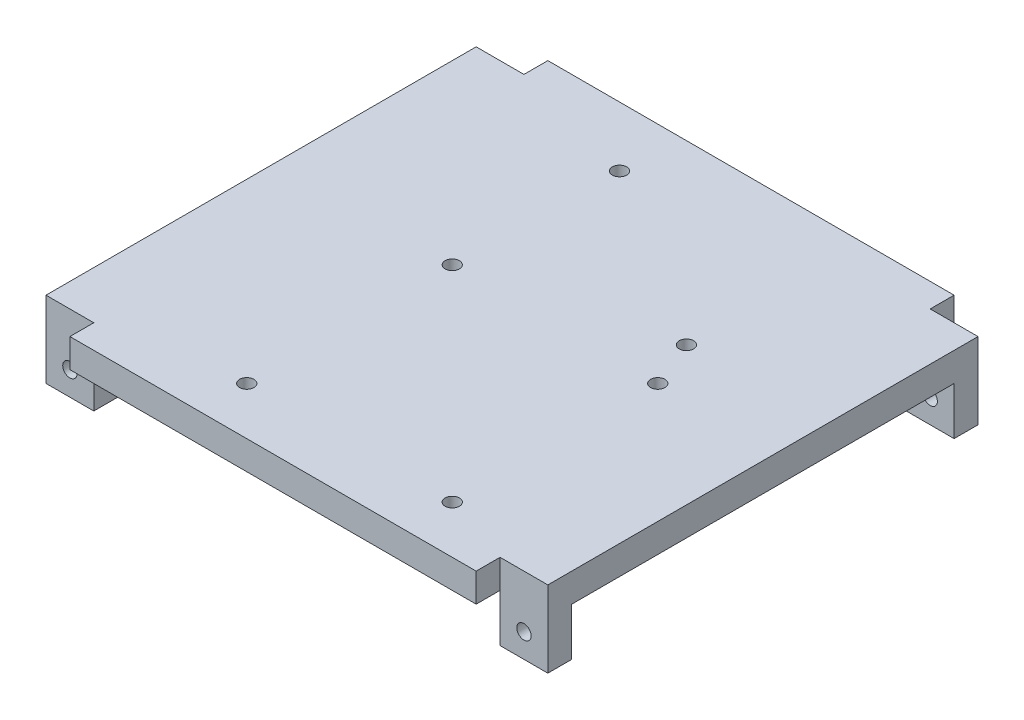
ISO-10303-21;
HEADER;
FILE_DESCRIPTION(('STEP AP214'),'2;1');
FILE_NAME('part.step','',(''),(''),'','','');
FILE_SCHEMA(('AUTOMOTIVE_DESIGN { 1 0 10303 214 1 1 1 1 }'));
ENDSEC;
DATA;
#1=APPLICATION_CONTEXT('core data for automotive mechanical design processes');
#2=APPLICATION_PROTOCOL_DEFINITION('international standard','automotive_design',2000,#1);
#3=PRODUCT_CONTEXT('',#1,'mechanical');
#4=PRODUCT('Part','Part','',(#3));
#5=PRODUCT_RELATED_PRODUCT_CATEGORY('part','',(#4));
#6=PRODUCT_DEFINITION_FORMATION('','',#4);
#7=PRODUCT_DEFINITION_CONTEXT('part definition',#1,'design');
#8=PRODUCT_DEFINITION('design','',#6,#7);
#9=PRODUCT_DEFINITION_SHAPE('','',#8);
#10=(LENGTH_UNIT() NAMED_UNIT(*) SI_UNIT(.MILLI.,.METRE.));
#11=(NAMED_UNIT(*) PLANE_ANGLE_UNIT() SI_UNIT($,.RADIAN.));
#12=(NAMED_UNIT(*) SI_UNIT($,.STERADIAN.) SOLID_ANGLE_UNIT());
#13=UNCERTAINTY_MEASURE_WITH_UNIT(LENGTH_MEASURE(1.E-05),#10,'distance_accuracy_value','');
#14=(GEOMETRIC_REPRESENTATION_CONTEXT(3) GLOBAL_UNCERTAINTY_ASSIGNED_CONTEXT((#13)) GLOBAL_UNIT_ASSIGNED_CONTEXT((#10,
#11,#12)) REPRESENTATION_CONTEXT('',''));
#15=CARTESIAN_POINT('',(0.,0.,0.));
#16=DIRECTION('',(0.,0.,1.));
#17=DIRECTION('',(1.,0.,0.));
#18=AXIS2_PLACEMENT_3D('',#15,#16,#17);
#19=CARTESIAN_POINT('',(0.,0.,0.));
#20=DIRECTION('',(0.,-1.,0.));
#21=DIRECTION('',(0.,0.,-1.));
#22=AXIS2_PLACEMENT_3D('',#19,#20,#21);
#23=PLANE('',#22);
#24=CARTESIAN_POINT('',(76.,0.,-63.));
#25=DIRECTION('',(0.,-1.,0.));
#26=DIRECTION('',(0.,0.,-1.));
#27=AXIS2_PLACEMENT_3D('',#24,#25,#26);
#28=CIRCLE('',#27,1.5);
#29=CARTESIAN_POINT('',(76.,0.,-64.5));
#30=VERTEX_POINT('',#29);
#31=EDGE_CURVE('E418',#30,#30,#28,.T.);
#32=ORIENTED_EDGE('',*,*,#31,.F.);
#33=EDGE_LOOP('',(#32));
#34=FACE_BOUND('',#33,.T.);
#35=CARTESIAN_POINT('',(37.5,0.,-87.5));
#36=DIRECTION('',(0.,-1.,0.));
#37=DIRECTION('',(0.,0.,-1.));
#38=AXIS2_PLACEMENT_3D('',#35,#36,#37);
#39=CIRCLE('',#38,1.5);
#40=CARTESIAN_POINT('',(37.5,0.,-89.));
#41=VERTEX_POINT('',#40);
#42=EDGE_CURVE('E412',#41,#41,#39,.T.);
#43=ORIENTED_EDGE('',*,*,#42,.F.);
#44=EDGE_LOOP('',(#43));
#45=FACE_BOUND('',#44,.T.);
#46=CARTESIAN_POINT('',(80.,0.,-10.));
#47=DIRECTION('',(0.,-1.,0.));
#48=DIRECTION('',(0.,0.,-1.));
#49=AXIS2_PLACEMENT_3D('',#46,#47,#48);
#50=CIRCLE('',#49,1.5);
#51=CARTESIAN_POINT('',(80.,0.,-11.5));
#52=VERTEX_POINT('',#51);
#53=EDGE_CURVE('E406',#52,#52,#50,.T.);
#54=ORIENTED_EDGE('',*,*,#53,.F.);
#55=EDGE_LOOP('',(#54));
#56=FACE_BOUND('',#55,.T.);
#57=CARTESIAN_POINT('',(80.,0.,-53.));
#58=DIRECTION('',(0.,-1.,0.));
#59=DIRECTION('',(0.,0.,-1.));
#60=AXIS2_PLACEMENT_3D('',#57,#58,#59);
#61=CIRCLE('',#60,1.5);
#62=CARTESIAN_POINT('',(80.,0.,-54.5));
#63=VERTEX_POINT('',#62);
#64=EDGE_CURVE('E400',#63,#63,#61,.T.);
#65=ORIENTED_EDGE('',*,*,#64,.F.);
#66=EDGE_LOOP('',(#65));
#67=FACE_BOUND('',#66,.T.);
#68=CARTESIAN_POINT('',(37.,0.,-53.));
#69=DIRECTION('',(0.,-1.,0.));
#70=DIRECTION('',(0.,0.,-1.));
#71=AXIS2_PLACEMENT_3D('',#68,#69,#70);
#72=CIRCLE('',#71,1.5);
#73=CARTESIAN_POINT('',(37.,0.,-54.5));
#74=VERTEX_POINT('',#73);
#75=EDGE_CURVE('E394',#74,#74,#72,.T.);
#76=ORIENTED_EDGE('',*,*,#75,.F.);
#77=EDGE_LOOP('',(#76));
#78=FACE_BOUND('',#77,.T.);
#79=CARTESIAN_POINT('',(37.,0.,-10.));
#80=DIRECTION('',(0.,-1.,0.));
#81=DIRECTION('',(0.,0.,-1.));
#82=AXIS2_PLACEMENT_3D('',#79,#80,#81);
#83=CIRCLE('',#82,1.5);
#84=CARTESIAN_POINT('',(37.,0.,-11.5));
#85=VERTEX_POINT('',#84);
#86=EDGE_CURVE('E388',#85,#85,#83,.T.);
#87=ORIENTED_EDGE('',*,*,#86,.F.);
#88=EDGE_LOOP('',(#87));
#89=FACE_BOUND('',#88,.T.);
#90=DIRECTION('',(-1.,0.,0.));
#91=VECTOR('',#90,1.);
#92=CARTESIAN_POINT('',(0.,0.,-90.));
#93=LINE('',#92,#91);
#94=CARTESIAN_POINT('',(9.99999999999999,0.,-90.));
#95=VERTEX_POINT('',#94);
#96=CARTESIAN_POINT('',(0.,0.,-90.));
#97=VERTEX_POINT('',#96);
#98=EDGE_CURVE('E214',#95,#97,#93,.T.);
#99=ORIENTED_EDGE('',*,*,#98,.F.);
#100=DIRECTION('',(0.,0.,1.));
#101=VECTOR('',#100,1.);
#102=CARTESIAN_POINT('',(9.99999999999998,0.,-95.));
#103=LINE('',#102,#101);
#104=CARTESIAN_POINT('',(9.99999999999998,0.,-95.));
#105=VERTEX_POINT('',#104);
#106=EDGE_CURVE('E216',#105,#95,#103,.T.);
#107=ORIENTED_EDGE('',*,*,#106,.F.);
#108=DIRECTION('',(0.,0.,1.));
#109=VECTOR('',#108,1.);
#110=CARTESIAN_POINT('',(10.,0.,-100.));
#111=LINE('',#110,#109);
#112=CARTESIAN_POINT('',(10.,0.,-100.));
#113=VERTEX_POINT('',#112);
#114=EDGE_CURVE('E326',#113,#105,#111,.T.);
#115=ORIENTED_EDGE('',*,*,#114,.F.);
#116=DIRECTION('',(-1.,0.,0.));
#117=VECTOR('',#116,1.);
#118=CARTESIAN_POINT('',(0.,0.,-100.));
#119=LINE('',#118,#117);
#120=CARTESIAN_POINT('',(95.,0.,-100.));
#121=VERTEX_POINT('',#120);
#122=EDGE_CURVE('E354',#121,#113,#119,.T.);
#123=ORIENTED_EDGE('',*,*,#122,.F.);
#124=DIRECTION('',(0.,0.,-1.));
#125=VECTOR('',#124,1.);
#126=CARTESIAN_POINT('',(95.,0.,-100.));
#127=LINE('',#126,#125);
#128=CARTESIAN_POINT('',(95.,0.,-95.));
#129=VERTEX_POINT('',#128);
#130=EDGE_CURVE('E336',#129,#121,#127,.T.);
#131=ORIENTED_EDGE('',*,*,#130,.F.);
#132=DIRECTION('',(0.,0.,-1.));
#133=VECTOR('',#132,1.);
#134=CARTESIAN_POINT('',(95.,0.,-95.));
#135=LINE('',#134,#133);
#136=CARTESIAN_POINT('',(95.,0.,-90.));
#137=VERTEX_POINT('',#136);
#138=EDGE_CURVE('E279',#137,#129,#135,.T.);
#139=ORIENTED_EDGE('',*,*,#138,.F.);
#140=DIRECTION('',(-1.,0.,0.));
#141=VECTOR('',#140,1.);
#142=CARTESIAN_POINT('',(105.,0.,-90.));
#143=LINE('',#142,#141);
#144=CARTESIAN_POINT('',(105.,0.,-90.));
#145=VERTEX_POINT('',#144);
#146=EDGE_CURVE('E274',#145,#137,#143,.T.);
#147=ORIENTED_EDGE('',*,*,#146,.F.);
#148=DIRECTION('',(0.,0.,-1.));
#149=VECTOR('',#148,1.);
#150=CARTESIAN_POINT('',(105.,0.,0.));
#151=LINE('',#150,#149);
#152=CARTESIAN_POINT('',(105.,0.,-10.));
#153=VERTEX_POINT('',#152);
#154=EDGE_CURVE('E50',#153,#145,#151,.T.);
#155=ORIENTED_EDGE('',*,*,#154,.F.);
#156=DIRECTION('',(1.,0.,0.));
#157=VECTOR('',#156,1.);
#158=CARTESIAN_POINT('',(105.,0.,-10.));
#159=LINE('',#158,#157);
#160=CARTESIAN_POINT('',(95.,0.,-10.));
#161=VERTEX_POINT('',#160);
#162=EDGE_CURVE('E259',#161,#153,#159,.T.);
#163=ORIENTED_EDGE('',*,*,#162,.F.);
#164=DIRECTION('',(0.,0.,-1.));
#165=VECTOR('',#164,1.);
#166=CARTESIAN_POINT('',(95.,0.,-5.00000000000001));
#167=LINE('',#166,#165);
#168=CARTESIAN_POINT('',(95.,0.,-5.00000000000001));
#169=VERTEX_POINT('',#168);
#170=EDGE_CURVE('E254',#169,#161,#167,.T.);
#171=ORIENTED_EDGE('',*,*,#170,.F.);
#172=DIRECTION('',(0.,0.,-1.));
#173=VECTOR('',#172,1.);
#174=CARTESIAN_POINT('',(95.,0.,0.));
#175=LINE('',#174,#173);
#176=CARTESIAN_POINT('',(95.,0.,0.));
#177=VERTEX_POINT('',#176);
#178=EDGE_CURVE('E310',#177,#169,#175,.T.);
#179=ORIENTED_EDGE('',*,*,#178,.F.);
#180=DIRECTION('',(1.,0.,0.));
#181=VECTOR('',#180,1.);
#182=CARTESIAN_POINT('',(0.,0.,0.));
#183=LINE('',#182,#181);
#184=CARTESIAN_POINT('',(10.,0.,0.));
#185=VERTEX_POINT('',#184);
#186=EDGE_CURVE('E58',#185,#177,#183,.T.);
#187=ORIENTED_EDGE('',*,*,#186,.F.);
#188=DIRECTION('',(0.,0.,1.));
#189=VECTOR('',#188,1.);
#190=CARTESIAN_POINT('',(10.,0.,0.));
#191=LINE('',#190,#189);
#192=CARTESIAN_POINT('',(9.99999999999999,0.,-5.00000000000001));
#193=VERTEX_POINT('',#192);
#194=EDGE_CURVE('E295',#193,#185,#191,.T.);
#195=ORIENTED_EDGE('',*,*,#194,.F.);
#196=DIRECTION('',(0.,0.,1.));
#197=VECTOR('',#196,1.);
#198=CARTESIAN_POINT('',(9.99999999999998,0.,-5.));
#199=LINE('',#198,#197);
#200=CARTESIAN_POINT('',(9.99999999999998,0.,-10.));
#201=VERTEX_POINT('',#200);
#202=EDGE_CURVE('E236',#201,#193,#199,.T.);
#203=ORIENTED_EDGE('',*,*,#202,.F.);
#204=DIRECTION('',(1.,0.,0.));
#205=VECTOR('',#204,1.);
#206=CARTESIAN_POINT('',(0.,0.,-10.));
#207=LINE('',#206,#205);
#208=CARTESIAN_POINT('',(0.,0.,-10.));
#209=VERTEX_POINT('',#208);
#210=EDGE_CURVE('E231',#209,#201,#207,.T.);
#211=ORIENTED_EDGE('',*,*,#210,.F.);
#212=DIRECTION('',(0.,0.,1.));
#213=VECTOR('',#212,1.);
#214=CARTESIAN_POINT('',(0.,0.,0.));
#215=LINE('',#214,#213);
#216=EDGE_CURVE('E351',#97,#209,#215,.T.);
#217=ORIENTED_EDGE('',*,*,#216,.F.);
#218=EDGE_LOOP('',(#99,#107,#115,#123,#131,#139,#147,#155,#163,#171,#179,#187,#195,#203,#211,#217));
#219=FACE_BOUND('',#218,.T.);
#220=ADVANCED_FACE('F33',(#34,#45,#56,#67,#78,#89,#219),#23,.T.);
#221=CARTESIAN_POINT('',(0.,6.,0.));
#222=DIRECTION('',(1.,0.,0.));
#223=DIRECTION('',(0.,0.,-1.));
#224=AXIS2_PLACEMENT_3D('',#221,#222,#223);
#225=PLANE('',#224);
#226=DIRECTION('',(0.,-1.,0.));
#227=VECTOR('',#226,1.);
#228=CARTESIAN_POINT('',(0.,10.,-95.));
#229=LINE('',#228,#227);
#230=CARTESIAN_POINT('',(0.,6.,-95.));
#231=VERTEX_POINT('',#230);
#232=CARTESIAN_POINT('',(0.,-10.,-95.));
#233=VERTEX_POINT('',#232);
#234=EDGE_CURVE('E188',#231,#233,#229,.T.);
#235=ORIENTED_EDGE('',*,*,#234,.T.);
#236=DIRECTION('',(0.,0.,-1.));
#237=VECTOR('',#236,1.);
#238=CARTESIAN_POINT('',(0.,-10.,-95.));
#239=LINE('',#238,#237);
#240=CARTESIAN_POINT('',(0.,-10.,-90.));
#241=VERTEX_POINT('',#240);
#242=EDGE_CURVE('E192',#241,#233,#239,.T.);
#243=ORIENTED_EDGE('',*,*,#242,.F.);
#244=DIRECTION('',(0.,1.,0.));
#245=VECTOR('',#244,1.);
#246=CARTESIAN_POINT('',(0.,-10.,-90.));
#247=LINE('',#246,#245);
#248=EDGE_CURVE('E224',#241,#97,#247,.T.);
#249=ORIENTED_EDGE('',*,*,#248,.T.);
#250=ORIENTED_EDGE('',*,*,#216,.T.);
#251=DIRECTION('',(0.,1.,0.));
#252=VECTOR('',#251,1.);
#253=CARTESIAN_POINT('',(0.,-10.,-10.));
#254=LINE('',#253,#252);
#255=CARTESIAN_POINT('',(0.,-10.,-10.));
#256=VERTEX_POINT('',#255);
#257=EDGE_CURVE('E251',#256,#209,#254,.T.);
#258=ORIENTED_EDGE('',*,*,#257,.F.);
#259=DIRECTION('',(0.,0.,-1.));
#260=VECTOR('',#259,1.);
#261=CARTESIAN_POINT('',(0.,-10.,-5.00000000000001));
#262=LINE('',#261,#260);
#263=CARTESIAN_POINT('',(0.,-10.,-5.00000000000001));
#264=VERTEX_POINT('',#263);
#265=EDGE_CURVE('E232',#264,#256,#262,.T.);
#266=ORIENTED_EDGE('',*,*,#265,.F.);
#267=DIRECTION('',(0.,-1.,0.));
#268=VECTOR('',#267,1.);
#269=CARTESIAN_POINT('',(0.,10.,-5.00000000000001));
#270=LINE('',#269,#268);
#271=CARTESIAN_POINT('',(0.,6.,-5.00000000000001));
#272=VERTEX_POINT('',#271);
#273=EDGE_CURVE('E297',#272,#264,#270,.T.);
#274=ORIENTED_EDGE('',*,*,#273,.F.);
#275=DIRECTION('',(0.,0.,1.));
#276=VECTOR('',#275,1.);
#277=CARTESIAN_POINT('',(0.,6.,0.));
#278=LINE('',#277,#276);
#279=EDGE_CURVE('E195',#231,#272,#278,.T.);
#280=ORIENTED_EDGE('',*,*,#279,.F.);
#281=EDGE_LOOP('',(#235,#243,#249,#250,#258,#266,#274,#280));
#282=FACE_BOUND('',#281,.T.);
#283=ADVANCED_FACE('F35',(#282),#225,.F.);
#284=CARTESIAN_POINT('',(0.,6.,0.));
#285=DIRECTION('',(0.,0.,-1.));
#286=DIRECTION('',(-1.,0.,0.));
#287=AXIS2_PLACEMENT_3D('',#284,#285,#286);
#288=PLANE('',#287);
#289=DIRECTION('',(1.,0.,0.));
#290=VECTOR('',#289,1.);
#291=CARTESIAN_POINT('',(0.,6.,0.));
#292=LINE('',#291,#290);
#293=CARTESIAN_POINT('',(10.,6.,0.));
#294=VERTEX_POINT('',#293);
#295=CARTESIAN_POINT('',(95.,6.,0.));
#296=VERTEX_POINT('',#295);
#297=EDGE_CURVE('E353',#294,#296,#292,.T.);
#298=ORIENTED_EDGE('',*,*,#297,.F.);
#299=DIRECTION('',(0.,-1.,0.));
#300=VECTOR('',#299,1.);
#301=CARTESIAN_POINT('',(10.,10.,0.));
#302=LINE('',#301,#300);
#303=EDGE_CURVE('E298',#294,#185,#302,.T.);
#304=ORIENTED_EDGE('',*,*,#303,.T.);
#305=ORIENTED_EDGE('',*,*,#186,.T.);
#306=DIRECTION('',(0.,-1.,0.));
#307=VECTOR('',#306,1.);
#308=CARTESIAN_POINT('',(95.,10.,0.));
#309=LINE('',#308,#307);
#310=EDGE_CURVE('E313',#296,#177,#309,.T.);
#311=ORIENTED_EDGE('',*,*,#310,.F.);
#312=EDGE_LOOP('',(#298,#304,#305,#311));
#313=FACE_BOUND('',#312,.T.);
#314=ADVANCED_FACE('F545',(#313),#288,.F.);
#315=CARTESIAN_POINT('',(105.,6.,0.));
#316=DIRECTION('',(-1.,0.,0.));
#317=DIRECTION('',(0.,0.,1.));
#318=AXIS2_PLACEMENT_3D('',#315,#316,#317);
#319=PLANE('',#318);
#320=DIRECTION('',(0.,0.,-1.));
#321=VECTOR('',#320,1.);
#322=CARTESIAN_POINT('',(105.,6.,0.));
#323=LINE('',#322,#321);
#324=CARTESIAN_POINT('',(105.,6.,-5.00000000000001));
#325=VERTEX_POINT('',#324);
#326=CARTESIAN_POINT('',(105.,6.,-95.));
#327=VERTEX_POINT('',#326);
#328=EDGE_CURVE('E42',#325,#327,#323,.T.);
#329=ORIENTED_EDGE('',*,*,#328,.F.);
#330=DIRECTION('',(0.,-1.,0.));
#331=VECTOR('',#330,1.);
#332=CARTESIAN_POINT('',(105.,10.,-5.00000000000001));
#333=LINE('',#332,#331);
#334=CARTESIAN_POINT('',(105.,-10.,-5.00000000000001));
#335=VERTEX_POINT('',#334);
#336=EDGE_CURVE('E314',#325,#335,#333,.T.);
#337=ORIENTED_EDGE('',*,*,#336,.T.);
#338=DIRECTION('',(0.,0.,1.));
#339=VECTOR('',#338,1.);
#340=CARTESIAN_POINT('',(105.,-10.,-5.00000000000001));
#341=LINE('',#340,#339);
#342=CARTESIAN_POINT('',(105.,-10.,-10.));
#343=VERTEX_POINT('',#342);
#344=EDGE_CURVE('E255',#343,#335,#341,.T.);
#345=ORIENTED_EDGE('',*,*,#344,.F.);
#346=DIRECTION('',(0.,1.,0.));
#347=VECTOR('',#346,1.);
#348=CARTESIAN_POINT('',(105.,-10.,-10.));
#349=LINE('',#348,#347);
#350=EDGE_CURVE('E265',#343,#153,#349,.T.);
#351=ORIENTED_EDGE('',*,*,#350,.T.);
#352=ORIENTED_EDGE('',*,*,#154,.T.);
#353=DIRECTION('',(0.,1.,0.));
#354=VECTOR('',#353,1.);
#355=CARTESIAN_POINT('',(105.,-10.,-90.));
#356=LINE('',#355,#354);
#357=CARTESIAN_POINT('',(105.,-10.,-90.));
#358=VERTEX_POINT('',#357);
#359=EDGE_CURVE('E294',#358,#145,#356,.T.);
#360=ORIENTED_EDGE('',*,*,#359,.F.);
#361=DIRECTION('',(0.,0.,1.));
#362=VECTOR('',#361,1.);
#363=CARTESIAN_POINT('',(105.,-10.,-95.));
#364=LINE('',#363,#362);
#365=CARTESIAN_POINT('',(105.,-10.,-95.));
#366=VERTEX_POINT('',#365);
#367=EDGE_CURVE('E275',#366,#358,#364,.T.);
#368=ORIENTED_EDGE('',*,*,#367,.F.);
#369=DIRECTION('',(0.,-1.,0.));
#370=VECTOR('',#369,1.);
#371=CARTESIAN_POINT('',(105.,10.,-95.));
#372=LINE('',#371,#370);
#373=EDGE_CURVE('E338',#327,#366,#372,.T.);
#374=ORIENTED_EDGE('',*,*,#373,.F.);
#375=EDGE_LOOP('',(#329,#337,#345,#351,#352,#360,#368,#374));
#376=FACE_BOUND('',#375,.T.);
#377=ADVANCED_FACE('F494',(#376),#319,.F.);
#378=CARTESIAN_POINT('',(0.,6.,-100.));
#379=DIRECTION('',(0.,0.,1.));
#380=DIRECTION('',(1.,0.,0.));
#381=AXIS2_PLACEMENT_3D('',#378,#379,#380);
#382=PLANE('',#381);
#383=ORIENTED_EDGE('',*,*,#122,.T.);
#384=DIRECTION('',(0.,-1.,0.));
#385=VECTOR('',#384,1.);
#386=CARTESIAN_POINT('',(10.,10.,-100.));
#387=LINE('',#386,#385);
#388=CARTESIAN_POINT('',(10.,6.,-100.));
#389=VERTEX_POINT('',#388);
#390=EDGE_CURVE('E328',#389,#113,#387,.T.);
#391=ORIENTED_EDGE('',*,*,#390,.F.);
#392=DIRECTION('',(-1.,0.,0.));
#393=VECTOR('',#392,1.);
#394=CARTESIAN_POINT('',(0.,6.,-100.));
#395=LINE('',#394,#393);
#396=CARTESIAN_POINT('',(95.,6.,-100.));
#397=VERTEX_POINT('',#396);
#398=EDGE_CURVE('E11',#397,#389,#395,.T.);
#399=ORIENTED_EDGE('',*,*,#398,.F.);
#400=DIRECTION('',(0.,-1.,0.));
#401=VECTOR('',#400,1.);
#402=CARTESIAN_POINT('',(95.,10.,-100.));
#403=LINE('',#402,#401);
#404=EDGE_CURVE('E339',#397,#121,#403,.T.);
#405=ORIENTED_EDGE('',*,*,#404,.T.);
#406=EDGE_LOOP('',(#383,#391,#399,#405));
#407=FACE_BOUND('',#406,.T.);
#408=ADVANCED_FACE('F482',(#407),#382,.F.);
#409=CARTESIAN_POINT('',(0.,6.,0.));
#410=DIRECTION('',(0.,-1.,0.));
#411=DIRECTION('',(0.,0.,-1.));
#412=AXIS2_PLACEMENT_3D('',#409,#410,#411);
#413=PLANE('',#412);
#414=CARTESIAN_POINT('',(76.,6.,-63.));
#415=DIRECTION('',(0.,-1.,0.));
#416=DIRECTION('',(0.,0.,-1.));
#417=AXIS2_PLACEMENT_3D('',#414,#415,#416);
#418=CIRCLE('',#417,1.5);
#419=CARTESIAN_POINT('',(76.,6.,-64.5));
#420=VERTEX_POINT('',#419);
#421=EDGE_CURVE('E415',#420,#420,#418,.T.);
#422=ORIENTED_EDGE('',*,*,#421,.T.);
#423=EDGE_LOOP('',(#422));
#424=FACE_BOUND('',#423,.T.);
#425=CARTESIAN_POINT('',(37.5,6.,-87.5));
#426=DIRECTION('',(0.,-1.,0.));
#427=DIRECTION('',(0.,0.,-1.));
#428=AXIS2_PLACEMENT_3D('',#425,#426,#427);
#429=CIRCLE('',#428,1.5);
#430=CARTESIAN_POINT('',(37.5,6.,-89.));
#431=VERTEX_POINT('',#430);
#432=EDGE_CURVE('E409',#431,#431,#429,.T.);
#433=ORIENTED_EDGE('',*,*,#432,.T.);
#434=EDGE_LOOP('',(#433));
#435=FACE_BOUND('',#434,.T.);
#436=CARTESIAN_POINT('',(80.,6.,-10.));
#437=DIRECTION('',(0.,-1.,0.));
#438=DIRECTION('',(0.,0.,-1.));
#439=AXIS2_PLACEMENT_3D('',#436,#437,#438);
#440=CIRCLE('',#439,1.5);
#441=CARTESIAN_POINT('',(80.,6.,-11.5));
#442=VERTEX_POINT('',#441);
#443=EDGE_CURVE('E403',#442,#442,#440,.T.);
#444=ORIENTED_EDGE('',*,*,#443,.T.);
#445=EDGE_LOOP('',(#444));
#446=FACE_BOUND('',#445,.T.);
#447=CARTESIAN_POINT('',(80.,6.,-53.));
#448=DIRECTION('',(0.,-1.,0.));
#449=DIRECTION('',(0.,0.,-1.));
#450=AXIS2_PLACEMENT_3D('',#447,#448,#449);
#451=CIRCLE('',#450,1.5);
#452=CARTESIAN_POINT('',(80.,6.,-54.5));
#453=VERTEX_POINT('',#452);
#454=EDGE_CURVE('E397',#453,#453,#451,.T.);
#455=ORIENTED_EDGE('',*,*,#454,.T.);
#456=EDGE_LOOP('',(#455));
#457=FACE_BOUND('',#456,.T.);
#458=CARTESIAN_POINT('',(37.,6.,-53.));
#459=DIRECTION('',(0.,-1.,0.));
#460=DIRECTION('',(0.,0.,-1.));
#461=AXIS2_PLACEMENT_3D('',#458,#459,#460);
#462=CIRCLE('',#461,1.5);
#463=CARTESIAN_POINT('',(37.,6.,-54.5));
#464=VERTEX_POINT('',#463);
#465=EDGE_CURVE('E391',#464,#464,#462,.T.);
#466=ORIENTED_EDGE('',*,*,#465,.T.);
#467=EDGE_LOOP('',(#466));
#468=FACE_BOUND('',#467,.T.);
#469=CARTESIAN_POINT('',(37.,6.,-10.));
#470=DIRECTION('',(0.,-1.,0.));
#471=DIRECTION('',(0.,0.,-1.));
#472=AXIS2_PLACEMENT_3D('',#469,#470,#471);
#473=CIRCLE('',#472,1.5);
#474=CARTESIAN_POINT('',(37.,6.,-11.5));
#475=VERTEX_POINT('',#474);
#476=EDGE_CURVE('E387',#475,#475,#473,.T.);
#477=ORIENTED_EDGE('',*,*,#476,.T.);
#478=EDGE_LOOP('',(#477));
#479=FACE_BOUND('',#478,.T.);
#480=DIRECTION('',(1.,0.,0.));
#481=VECTOR('',#480,1.);
#482=CARTESIAN_POINT('',(0.,6.,-5.00000000000001));
#483=LINE('',#482,#481);
#484=CARTESIAN_POINT('',(9.99999999999999,6.,-5.00000000000001));
#485=VERTEX_POINT('',#484);
#486=EDGE_CURVE('E300',#272,#485,#483,.T.);
#487=ORIENTED_EDGE('',*,*,#486,.T.);
#488=DIRECTION('',(0.,0.,1.));
#489=VECTOR('',#488,1.);
#490=CARTESIAN_POINT('',(10.,6.,0.));
#491=LINE('',#490,#489);
#492=EDGE_CURVE('E307',#485,#294,#491,.T.);
#493=ORIENTED_EDGE('',*,*,#492,.T.);
#494=ORIENTED_EDGE('',*,*,#297,.T.);
#495=DIRECTION('',(0.,0.,-1.));
#496=VECTOR('',#495,1.);
#497=CARTESIAN_POINT('',(95.,6.,0.));
#498=LINE('',#497,#496);
#499=CARTESIAN_POINT('',(95.,6.,-5.00000000000001));
#500=VERTEX_POINT('',#499);
#501=EDGE_CURVE('E316',#296,#500,#498,.T.);
#502=ORIENTED_EDGE('',*,*,#501,.T.);
#503=DIRECTION('',(1.,0.,0.));
#504=VECTOR('',#503,1.);
#505=CARTESIAN_POINT('',(0.,6.,-5.00000000000002));
#506=LINE('',#505,#504);
#507=EDGE_CURVE('E323',#500,#325,#506,.T.);
#508=ORIENTED_EDGE('',*,*,#507,.T.);
#509=ORIENTED_EDGE('',*,*,#328,.T.);
#510=DIRECTION('',(-1.,0.,0.));
#511=VECTOR('',#510,1.);
#512=CARTESIAN_POINT('',(0.,6.,-95.));
#513=LINE('',#512,#511);
#514=CARTESIAN_POINT('',(95.,6.,-95.));
#515=VERTEX_POINT('',#514);
#516=EDGE_CURVE('E342',#327,#515,#513,.T.);
#517=ORIENTED_EDGE('',*,*,#516,.T.);
#518=DIRECTION('',(0.,0.,-1.));
#519=VECTOR('',#518,1.);
#520=CARTESIAN_POINT('',(95.,6.,0.));
#521=LINE('',#520,#519);
#522=EDGE_CURVE('E348',#515,#397,#521,.T.);
#523=ORIENTED_EDGE('',*,*,#522,.T.);
#524=ORIENTED_EDGE('',*,*,#398,.T.);
#525=DIRECTION('',(0.,0.,1.));
#526=VECTOR('',#525,1.);
#527=CARTESIAN_POINT('',(10.,6.,0.));
#528=LINE('',#527,#526);
#529=CARTESIAN_POINT('',(10.,6.,-95.));
#530=VERTEX_POINT('',#529);
#531=EDGE_CURVE('E198',#389,#530,#528,.T.);
#532=ORIENTED_EDGE('',*,*,#531,.T.);
#533=DIRECTION('',(-1.,0.,0.));
#534=VECTOR('',#533,1.);
#535=CARTESIAN_POINT('',(0.,6.,-95.));
#536=LINE('',#535,#534);
#537=EDGE_CURVE('E334',#530,#231,#536,.T.);
#538=ORIENTED_EDGE('',*,*,#537,.T.);
#539=ORIENTED_EDGE('',*,*,#279,.T.);
#540=EDGE_LOOP('',(#487,#493,#494,#502,#508,#509,#517,#523,#524,#532,#538,#539));
#541=FACE_BOUND('',#540,.T.);
#542=ADVANCED_FACE('F424',(#424,#435,#446,#457,#468,#479,#541),#413,.F.);
#543=CARTESIAN_POINT('',(95.,10.,-100.));
#544=DIRECTION('',(-1.,0.,0.));
#545=DIRECTION('',(0.,0.,1.));
#546=AXIS2_PLACEMENT_3D('',#543,#544,#545);
#547=PLANE('',#546);
#548=DIRECTION('',(0.,-1.,0.));
#549=VECTOR('',#548,1.);
#550=CARTESIAN_POINT('',(95.,10.,-95.));
#551=LINE('',#550,#549);
#552=EDGE_CURVE('E343',#515,#129,#551,.T.);
#553=ORIENTED_EDGE('',*,*,#552,.T.);
#554=ORIENTED_EDGE('',*,*,#130,.T.);
#555=ORIENTED_EDGE('',*,*,#404,.F.);
#556=ORIENTED_EDGE('',*,*,#522,.F.);
#557=EDGE_LOOP('',(#553,#554,#555,#556));
#558=FACE_BOUND('',#557,.T.);
#559=ADVANCED_FACE('F485',(#558),#547,.F.);
#560=CARTESIAN_POINT('',(105.,10.,-95.));
#561=DIRECTION('',(0.,0.,1.));
#562=DIRECTION('',(1.,0.,0.));
#563=AXIS2_PLACEMENT_3D('',#560,#561,#562);
#564=PLANE('',#563);
#565=CARTESIAN_POINT('',(100.,-5.,-95.));
#566=DIRECTION('',(0.,0.,-1.));
#567=DIRECTION('',(-1.,0.,0.));
#568=AXIS2_PLACEMENT_3D('',#565,#566,#567);
#569=CIRCLE('',#568,1.5);
#570=CARTESIAN_POINT('',(98.5,-5.,-95.));
#571=VERTEX_POINT('',#570);
#572=EDGE_CURVE('E369',#571,#571,#569,.T.);
#573=ORIENTED_EDGE('',*,*,#572,.F.);
#574=EDGE_LOOP('',(#573));
#575=FACE_BOUND('',#574,.T.);
#576=ORIENTED_EDGE('',*,*,#373,.T.);
#577=DIRECTION('',(1.,0.,0.));
#578=VECTOR('',#577,1.);
#579=CARTESIAN_POINT('',(105.,-10.,-95.));
#580=LINE('',#579,#578);
#581=CARTESIAN_POINT('',(95.,-10.,-95.));
#582=VERTEX_POINT('',#581);
#583=EDGE_CURVE('E283',#582,#366,#580,.T.);
#584=ORIENTED_EDGE('',*,*,#583,.F.);
#585=DIRECTION('',(0.,1.,0.));
#586=VECTOR('',#585,1.);
#587=CARTESIAN_POINT('',(95.,-10.,-95.));
#588=LINE('',#587,#586);
#589=EDGE_CURVE('E286',#582,#129,#588,.T.);
#590=ORIENTED_EDGE('',*,*,#589,.T.);
#591=ORIENTED_EDGE('',*,*,#552,.F.);
#592=ORIENTED_EDGE('',*,*,#516,.F.);
#593=EDGE_LOOP('',(#576,#584,#590,#591,#592));
#594=FACE_BOUND('',#593,.T.);
#595=ADVANCED_FACE('F491',(#575,#594),#564,.F.);
#596=CARTESIAN_POINT('',(0.,10.,-95.));
#597=DIRECTION('',(0.,0.,1.));
#598=DIRECTION('',(1.,0.,0.));
#599=AXIS2_PLACEMENT_3D('',#596,#597,#598);
#600=PLANE('',#599);
#601=CARTESIAN_POINT('',(4.99999999999998,-5.,-95.));
#602=DIRECTION('',(0.,0.,-1.));
#603=DIRECTION('',(-1.,0.,0.));
#604=AXIS2_PLACEMENT_3D('',#601,#602,#603);
#605=CIRCLE('',#604,1.5);
#606=CARTESIAN_POINT('',(3.49999999999998,-5.,-95.));
#607=VERTEX_POINT('',#606);
#608=EDGE_CURVE('E384',#607,#607,#605,.T.);
#609=ORIENTED_EDGE('',*,*,#608,.F.);
#610=EDGE_LOOP('',(#609));
#611=FACE_BOUND('',#610,.T.);
#612=DIRECTION('',(0.,-1.,0.));
#613=VECTOR('',#612,1.);
#614=CARTESIAN_POINT('',(10.,10.,-95.));
#615=LINE('',#614,#613);
#616=EDGE_CURVE('E199',#530,#105,#615,.T.);
#617=ORIENTED_EDGE('',*,*,#616,.T.);
#618=DIRECTION('',(0.,1.,0.));
#619=VECTOR('',#618,1.);
#620=CARTESIAN_POINT('',(9.99999999999998,-10.,-95.));
#621=LINE('',#620,#619);
#622=CARTESIAN_POINT('',(9.99999999999998,-10.,-95.));
#623=VERTEX_POINT('',#622);
#624=EDGE_CURVE('E205',#623,#105,#621,.T.);
#625=ORIENTED_EDGE('',*,*,#624,.F.);
#626=DIRECTION('',(1.,0.,0.));
#627=VECTOR('',#626,1.);
#628=CARTESIAN_POINT('',(0.,-10.,-95.));
#629=LINE('',#628,#627);
#630=EDGE_CURVE('E202',#233,#623,#629,.T.);
#631=ORIENTED_EDGE('',*,*,#630,.F.);
#632=ORIENTED_EDGE('',*,*,#234,.F.);
#633=ORIENTED_EDGE('',*,*,#537,.F.);
#634=EDGE_LOOP('',(#617,#625,#631,#632,#633));
#635=FACE_BOUND('',#634,.T.);
#636=ADVANCED_FACE('F204',(#611,#635),#600,.F.);
#637=CARTESIAN_POINT('',(10.,10.,-100.));
#638=DIRECTION('',(1.,0.,0.));
#639=DIRECTION('',(0.,0.,-1.));
#640=AXIS2_PLACEMENT_3D('',#637,#638,#639);
#641=PLANE('',#640);
#642=ORIENTED_EDGE('',*,*,#390,.T.);
#643=ORIENTED_EDGE('',*,*,#114,.T.);
#644=ORIENTED_EDGE('',*,*,#616,.F.);
#645=ORIENTED_EDGE('',*,*,#531,.F.);
#646=EDGE_LOOP('',(#642,#643,#644,#645));
#647=FACE_BOUND('',#646,.T.);
#648=ADVANCED_FACE('F476',(#647),#641,.F.);
#649=CARTESIAN_POINT('',(105.,10.,-5.00000000000001));
#650=DIRECTION('',(0.,0.,-1.));
#651=DIRECTION('',(-1.,0.,0.));
#652=AXIS2_PLACEMENT_3D('',#649,#650,#651);
#653=PLANE('',#652);
#654=CARTESIAN_POINT('',(100.,-5.,-5.00000000000001));
#655=DIRECTION('',(0.,0.,-1.));
#656=DIRECTION('',(-1.,0.,0.));
#657=AXIS2_PLACEMENT_3D('',#654,#655,#656);
#658=CIRCLE('',#657,1.5);
#659=CARTESIAN_POINT('',(98.5,-5.,-5.00000000000001));
#660=VERTEX_POINT('',#659);
#661=EDGE_CURVE('E219',#660,#660,#658,.T.);
#662=ORIENTED_EDGE('',*,*,#661,.T.);
#663=EDGE_LOOP('',(#662));
#664=FACE_BOUND('',#663,.T.);
#665=DIRECTION('',(0.,-1.,0.));
#666=VECTOR('',#665,1.);
#667=CARTESIAN_POINT('',(95.,10.,-5.00000000000001));
#668=LINE('',#667,#666);
#669=EDGE_CURVE('E317',#500,#169,#668,.T.);
#670=ORIENTED_EDGE('',*,*,#669,.T.);
#671=DIRECTION('',(0.,1.,0.));
#672=VECTOR('',#671,1.);
#673=CARTESIAN_POINT('',(95.,-10.,-5.00000000000001));
#674=LINE('',#673,#672);
#675=CARTESIAN_POINT('',(95.,-10.,-5.00000000000001));
#676=VERTEX_POINT('',#675);
#677=EDGE_CURVE('E272',#676,#169,#674,.T.);
#678=ORIENTED_EDGE('',*,*,#677,.F.);
#679=DIRECTION('',(-1.,0.,0.));
#680=VECTOR('',#679,1.);
#681=CARTESIAN_POINT('',(105.,-10.,-5.00000000000001));
#682=LINE('',#681,#680);
#683=EDGE_CURVE('E258',#335,#676,#682,.T.);
#684=ORIENTED_EDGE('',*,*,#683,.F.);
#685=ORIENTED_EDGE('',*,*,#336,.F.);
#686=ORIENTED_EDGE('',*,*,#507,.F.);
#687=EDGE_LOOP('',(#670,#678,#684,#685,#686));
#688=FACE_BOUND('',#687,.T.);
#689=ADVANCED_FACE('F523',(#664,#688),#653,.F.);
#690=CARTESIAN_POINT('',(95.,10.,0.));
#691=DIRECTION('',(-1.,0.,0.));
#692=DIRECTION('',(0.,0.,1.));
#693=AXIS2_PLACEMENT_3D('',#690,#691,#692);
#694=PLANE('',#693);
#695=ORIENTED_EDGE('',*,*,#310,.T.);
#696=ORIENTED_EDGE('',*,*,#178,.T.);
#697=ORIENTED_EDGE('',*,*,#669,.F.);
#698=ORIENTED_EDGE('',*,*,#501,.F.);
#699=EDGE_LOOP('',(#695,#696,#697,#698));
#700=FACE_BOUND('',#699,.T.);
#701=ADVANCED_FACE('F521',(#700),#694,.F.);
#702=CARTESIAN_POINT('',(10.,10.,0.));
#703=DIRECTION('',(1.,0.,0.));
#704=DIRECTION('',(0.,0.,-1.));
#705=AXIS2_PLACEMENT_3D('',#702,#703,#704);
#706=PLANE('',#705);
#707=DIRECTION('',(0.,-1.,0.));
#708=VECTOR('',#707,1.);
#709=CARTESIAN_POINT('',(9.99999999999999,10.,-5.00000000000001));
#710=LINE('',#709,#708);
#711=EDGE_CURVE('E301',#485,#193,#710,.T.);
#712=ORIENTED_EDGE('',*,*,#711,.T.);
#713=ORIENTED_EDGE('',*,*,#194,.T.);
#714=ORIENTED_EDGE('',*,*,#303,.F.);
#715=ORIENTED_EDGE('',*,*,#492,.F.);
#716=EDGE_LOOP('',(#712,#713,#714,#715));
#717=FACE_BOUND('',#716,.T.);
#718=ADVANCED_FACE('F469',(#717),#706,.F.);
#719=CARTESIAN_POINT('',(0.,10.,-5.00000000000001));
#720=DIRECTION('',(0.,0.,-1.));
#721=DIRECTION('',(-1.,0.,0.));
#722=AXIS2_PLACEMENT_3D('',#719,#720,#721);
#723=PLANE('',#722);
#724=CARTESIAN_POINT('',(4.99999999999998,-5.,-5.00000000000001));
#725=DIRECTION('',(0.,0.,-1.));
#726=DIRECTION('',(-1.,0.,0.));
#727=AXIS2_PLACEMENT_3D('',#724,#725,#726);
#728=CIRCLE('',#727,1.5);
#729=CARTESIAN_POINT('',(3.49999999999998,-5.,-5.00000000000001));
#730=VERTEX_POINT('',#729);
#731=EDGE_CURVE('E374',#730,#730,#728,.T.);
#732=ORIENTED_EDGE('',*,*,#731,.T.);
#733=EDGE_LOOP('',(#732));
#734=FACE_BOUND('',#733,.T.);
#735=ORIENTED_EDGE('',*,*,#273,.T.);
#736=DIRECTION('',(-1.,0.,0.));
#737=VECTOR('',#736,1.);
#738=CARTESIAN_POINT('',(0.,-10.,-5.00000000000001));
#739=LINE('',#738,#737);
#740=CARTESIAN_POINT('',(9.99999999999998,-10.,-5.));
#741=VERTEX_POINT('',#740);
#742=EDGE_CURVE('E240',#741,#264,#739,.T.);
#743=ORIENTED_EDGE('',*,*,#742,.F.);
#744=DIRECTION('',(0.,1.,0.));
#745=VECTOR('',#744,1.);
#746=CARTESIAN_POINT('',(9.99999999999998,-10.,-5.));
#747=LINE('',#746,#745);
#748=EDGE_CURVE('E243',#741,#193,#747,.T.);
#749=ORIENTED_EDGE('',*,*,#748,.T.);
#750=ORIENTED_EDGE('',*,*,#711,.F.);
#751=ORIENTED_EDGE('',*,*,#486,.F.);
#752=EDGE_LOOP('',(#735,#743,#749,#750,#751));
#753=FACE_BOUND('',#752,.T.);
#754=ADVANCED_FACE('F471',(#734,#753),#723,.F.);
#755=CARTESIAN_POINT('',(105.,-10.,-90.));
#756=DIRECTION('',(0.,0.,-1.));
#757=DIRECTION('',(-1.,0.,0.));
#758=AXIS2_PLACEMENT_3D('',#755,#756,#757);
#759=PLANE('',#758);
#760=CARTESIAN_POINT('',(100.,-5.,-90.));
#761=DIRECTION('',(0.,0.,-1.));
#762=DIRECTION('',(-1.,0.,0.));
#763=AXIS2_PLACEMENT_3D('',#760,#761,#762);
#764=CIRCLE('',#763,1.5);
#765=CARTESIAN_POINT('',(98.5,-5.,-90.));
#766=VERTEX_POINT('',#765);
#767=EDGE_CURVE('E368',#766,#766,#764,.T.);
#768=ORIENTED_EDGE('',*,*,#767,.T.);
#769=EDGE_LOOP('',(#768));
#770=FACE_BOUND('',#769,.T.);
#771=ORIENTED_EDGE('',*,*,#146,.T.);
#772=DIRECTION('',(0.,1.,0.));
#773=VECTOR('',#772,1.);
#774=CARTESIAN_POINT('',(95.,-10.,-90.));
#775=LINE('',#774,#773);
#776=CARTESIAN_POINT('',(95.,-10.,-90.));
#777=VERTEX_POINT('',#776);
#778=EDGE_CURVE('E291',#777,#137,#775,.T.);
#779=ORIENTED_EDGE('',*,*,#778,.F.);
#780=DIRECTION('',(-1.,0.,0.));
#781=VECTOR('',#780,1.);
#782=CARTESIAN_POINT('',(105.,-10.,-90.));
#783=LINE('',#782,#781);
#784=EDGE_CURVE('E278',#358,#777,#783,.T.);
#785=ORIENTED_EDGE('',*,*,#784,.F.);
#786=ORIENTED_EDGE('',*,*,#359,.T.);
#787=EDGE_LOOP('',(#771,#779,#785,#786));
#788=FACE_BOUND('',#787,.T.);
#789=ADVANCED_FACE('F505',(#770,#788),#759,.F.);
#790=CARTESIAN_POINT('',(95.,-10.,-95.));
#791=DIRECTION('',(1.,0.,0.));
#792=DIRECTION('',(0.,0.,-1.));
#793=AXIS2_PLACEMENT_3D('',#790,#791,#792);
#794=PLANE('',#793);
#795=ORIENTED_EDGE('',*,*,#138,.T.);
#796=ORIENTED_EDGE('',*,*,#589,.F.);
#797=DIRECTION('',(0.,0.,-1.));
#798=VECTOR('',#797,1.);
#799=CARTESIAN_POINT('',(95.,-10.,-95.));
#800=LINE('',#799,#798);
#801=EDGE_CURVE('E281',#777,#582,#800,.T.);
#802=ORIENTED_EDGE('',*,*,#801,.F.);
#803=ORIENTED_EDGE('',*,*,#778,.T.);
#804=EDGE_LOOP('',(#795,#796,#802,#803));
#805=FACE_BOUND('',#804,.T.);
#806=ADVANCED_FACE('F502',(#805),#794,.F.);
#807=CARTESIAN_POINT('',(0.,-10.,0.));
#808=DIRECTION('',(0.,-1.,0.));
#809=DIRECTION('',(0.,0.,-1.));
#810=AXIS2_PLACEMENT_3D('',#807,#808,#809);
#811=PLANE('',#810);
#812=ORIENTED_EDGE('',*,*,#367,.T.);
#813=ORIENTED_EDGE('',*,*,#784,.T.);
#814=ORIENTED_EDGE('',*,*,#801,.T.);
#815=ORIENTED_EDGE('',*,*,#583,.T.);
#816=EDGE_LOOP('',(#812,#813,#814,#815));
#817=FACE_BOUND('',#816,.T.);
#818=ADVANCED_FACE('F497',(#817),#811,.T.);
#819=CARTESIAN_POINT('',(95.,-10.,-5.00000000000001));
#820=DIRECTION('',(1.,0.,0.));
#821=DIRECTION('',(0.,0.,-1.));
#822=AXIS2_PLACEMENT_3D('',#819,#820,#821);
#823=PLANE('',#822);
#824=ORIENTED_EDGE('',*,*,#170,.T.);
#825=DIRECTION('',(0.,1.,0.));
#826=VECTOR('',#825,1.);
#827=CARTESIAN_POINT('',(95.,-10.,-10.));
#828=LINE('',#827,#826);
#829=CARTESIAN_POINT('',(95.,-10.,-10.));
#830=VERTEX_POINT('',#829);
#831=EDGE_CURVE('E269',#830,#161,#828,.T.);
#832=ORIENTED_EDGE('',*,*,#831,.F.);
#833=DIRECTION('',(0.,0.,-1.));
#834=VECTOR('',#833,1.);
#835=CARTESIAN_POINT('',(95.,-10.,-5.00000000000001));
#836=LINE('',#835,#834);
#837=EDGE_CURVE('E261',#676,#830,#836,.T.);
#838=ORIENTED_EDGE('',*,*,#837,.F.);
#839=ORIENTED_EDGE('',*,*,#677,.T.);
#840=EDGE_LOOP('',(#824,#832,#838,#839));
#841=FACE_BOUND('',#840,.T.);
#842=ADVANCED_FACE('F568',(#841),#823,.F.);
#843=CARTESIAN_POINT('',(105.,-10.,-10.));
#844=DIRECTION('',(0.,0.,1.));
#845=DIRECTION('',(1.,0.,0.));
#846=AXIS2_PLACEMENT_3D('',#843,#844,#845);
#847=PLANE('',#846);
#848=CARTESIAN_POINT('',(100.,-5.,-10.));
#849=DIRECTION('',(0.,0.,1.));
#850=DIRECTION('',(1.,0.,0.));
#851=AXIS2_PLACEMENT_3D('',#848,#849,#850);
#852=CIRCLE('',#851,1.5);
#853=CARTESIAN_POINT('',(101.5,-5.,-10.));
#854=VERTEX_POINT('',#853);
#855=EDGE_CURVE('E366',#854,#854,#852,.T.);
#856=ORIENTED_EDGE('',*,*,#855,.T.);
#857=EDGE_LOOP('',(#856));
#858=FACE_BOUND('',#857,.T.);
#859=ORIENTED_EDGE('',*,*,#162,.T.);
#860=ORIENTED_EDGE('',*,*,#350,.F.);
#861=DIRECTION('',(1.,0.,0.));
#862=VECTOR('',#861,1.);
#863=CARTESIAN_POINT('',(105.,-10.,-10.));
#864=LINE('',#863,#862);
#865=EDGE_CURVE('E263',#830,#343,#864,.T.);
#866=ORIENTED_EDGE('',*,*,#865,.F.);
#867=ORIENTED_EDGE('',*,*,#831,.T.);
#868=EDGE_LOOP('',(#859,#860,#866,#867));
#869=FACE_BOUND('',#868,.T.);
#870=ADVANCED_FACE('F564',(#858,#869),#847,.F.);
#871=CARTESIAN_POINT('',(0.,-10.,0.));
#872=DIRECTION('',(0.,1.,0.));
#873=DIRECTION('',(0.,0.,1.));
#874=AXIS2_PLACEMENT_3D('',#871,#872,#873);
#875=PLANE('',#874);
#876=ORIENTED_EDGE('',*,*,#344,.T.);
#877=ORIENTED_EDGE('',*,*,#683,.T.);
#878=ORIENTED_EDGE('',*,*,#837,.T.);
#879=ORIENTED_EDGE('',*,*,#865,.T.);
#880=EDGE_LOOP('',(#876,#877,#878,#879));
#881=FACE_BOUND('',#880,.T.);
#882=ADVANCED_FACE('F560',(#881),#875,.F.);
#883=CARTESIAN_POINT('',(0.,-10.,-10.));
#884=DIRECTION('',(0.,0.,1.));
#885=DIRECTION('',(1.,0.,0.));
#886=AXIS2_PLACEMENT_3D('',#883,#884,#885);
#887=PLANE('',#886);
#888=CARTESIAN_POINT('',(4.99999999999998,-5.,-10.));
#889=DIRECTION('',(0.,0.,1.));
#890=DIRECTION('',(1.,0.,0.));
#891=AXIS2_PLACEMENT_3D('',#888,#889,#890);
#892=CIRCLE('',#891,1.5);
#893=CARTESIAN_POINT('',(6.49999999999998,-5.,-10.));
#894=VERTEX_POINT('',#893);
#895=EDGE_CURVE('E379',#894,#894,#892,.T.);
#896=ORIENTED_EDGE('',*,*,#895,.T.);
#897=EDGE_LOOP('',(#896));
#898=FACE_BOUND('',#897,.T.);
#899=ORIENTED_EDGE('',*,*,#210,.T.);
#900=DIRECTION('',(0.,1.,0.));
#901=VECTOR('',#900,1.);
#902=CARTESIAN_POINT('',(9.99999999999998,-10.,-10.));
#903=LINE('',#902,#901);
#904=CARTESIAN_POINT('',(9.99999999999998,-10.,-10.));
#905=VERTEX_POINT('',#904);
#906=EDGE_CURVE('E248',#905,#201,#903,.T.);
#907=ORIENTED_EDGE('',*,*,#906,.F.);
#908=DIRECTION('',(1.,0.,0.));
#909=VECTOR('',#908,1.);
#910=CARTESIAN_POINT('',(0.,-10.,-10.));
#911=LINE('',#910,#909);
#912=EDGE_CURVE('E235',#256,#905,#911,.T.);
#913=ORIENTED_EDGE('',*,*,#912,.F.);
#914=ORIENTED_EDGE('',*,*,#257,.T.);
#915=EDGE_LOOP('',(#899,#907,#913,#914));
#916=FACE_BOUND('',#915,.T.);
#917=ADVANCED_FACE('F458',(#898,#916),#887,.F.);
#918=CARTESIAN_POINT('',(9.99999999999998,-10.,-5.));
#919=DIRECTION('',(-1.,0.,0.));
#920=DIRECTION('',(0.,0.,1.));
#921=AXIS2_PLACEMENT_3D('',#918,#919,#920);
#922=PLANE('',#921);
#923=ORIENTED_EDGE('',*,*,#202,.T.);
#924=ORIENTED_EDGE('',*,*,#748,.F.);
#925=DIRECTION('',(0.,0.,1.));
#926=VECTOR('',#925,1.);
#927=CARTESIAN_POINT('',(9.99999999999998,-10.,-5.));
#928=LINE('',#927,#926);
#929=EDGE_CURVE('E238',#905,#741,#928,.T.);
#930=ORIENTED_EDGE('',*,*,#929,.F.);
#931=ORIENTED_EDGE('',*,*,#906,.T.);
#932=EDGE_LOOP('',(#923,#924,#930,#931));
#933=FACE_BOUND('',#932,.T.);
#934=ADVANCED_FACE('F464',(#933),#922,.F.);
#935=CARTESIAN_POINT('',(0.,-10.,0.));
#936=DIRECTION('',(0.,-1.,0.));
#937=DIRECTION('',(0.,0.,-1.));
#938=AXIS2_PLACEMENT_3D('',#935,#936,#937);
#939=PLANE('',#938);
#940=ORIENTED_EDGE('',*,*,#265,.T.);
#941=ORIENTED_EDGE('',*,*,#912,.T.);
#942=ORIENTED_EDGE('',*,*,#929,.T.);
#943=ORIENTED_EDGE('',*,*,#742,.T.);
#944=EDGE_LOOP('',(#940,#941,#942,#943));
#945=FACE_BOUND('',#944,.T.);
#946=ADVANCED_FACE('F584',(#945),#939,.T.);
#947=CARTESIAN_POINT('',(9.99999999999998,-10.,-95.));
#948=DIRECTION('',(-1.,0.,0.));
#949=DIRECTION('',(0.,0.,1.));
#950=AXIS2_PLACEMENT_3D('',#947,#948,#949);
#951=PLANE('',#950);
#952=ORIENTED_EDGE('',*,*,#106,.T.);
#953=DIRECTION('',(0.,1.,0.));
#954=VECTOR('',#953,1.);
#955=CARTESIAN_POINT('',(9.99999999999999,-10.,-90.));
#956=LINE('',#955,#954);
#957=CARTESIAN_POINT('',(9.99999999999999,-10.,-90.));
#958=VERTEX_POINT('',#957);
#959=EDGE_CURVE('E227',#958,#95,#956,.T.);
#960=ORIENTED_EDGE('',*,*,#959,.F.);
#961=DIRECTION('',(0.,0.,1.));
#962=VECTOR('',#961,1.);
#963=CARTESIAN_POINT('',(9.99999999999998,-10.,-95.));
#964=LINE('',#963,#962);
#965=EDGE_CURVE('E208',#623,#958,#964,.T.);
#966=ORIENTED_EDGE('',*,*,#965,.F.);
#967=ORIENTED_EDGE('',*,*,#624,.T.);
#968=EDGE_LOOP('',(#952,#960,#966,#967));
#969=FACE_BOUND('',#968,.T.);
#970=ADVANCED_FACE('F587',(#969),#951,.F.);
#971=CARTESIAN_POINT('',(0.,-10.,-90.));
#972=DIRECTION('',(0.,0.,-1.));
#973=DIRECTION('',(-1.,0.,0.));
#974=AXIS2_PLACEMENT_3D('',#971,#972,#973);
#975=PLANE('',#974);
#976=CARTESIAN_POINT('',(4.99999999999998,-5.,-90.));
#977=DIRECTION('',(0.,0.,-1.));
#978=DIRECTION('',(-1.,0.,0.));
#979=AXIS2_PLACEMENT_3D('',#976,#977,#978);
#980=CIRCLE('',#979,1.5);
#981=CARTESIAN_POINT('',(3.49999999999998,-5.,-90.));
#982=VERTEX_POINT('',#981);
#983=EDGE_CURVE('E37',#982,#982,#980,.T.);
#984=ORIENTED_EDGE('',*,*,#983,.T.);
#985=EDGE_LOOP('',(#984));
#986=FACE_BOUND('',#985,.T.);
#987=ORIENTED_EDGE('',*,*,#98,.T.);
#988=ORIENTED_EDGE('',*,*,#248,.F.);
#989=DIRECTION('',(-1.,0.,0.));
#990=VECTOR('',#989,1.);
#991=CARTESIAN_POINT('',(0.,-10.,-90.));
#992=LINE('',#991,#990);
#993=EDGE_CURVE('E212',#958,#241,#992,.T.);
#994=ORIENTED_EDGE('',*,*,#993,.F.);
#995=ORIENTED_EDGE('',*,*,#959,.T.);
#996=EDGE_LOOP('',(#987,#988,#994,#995));
#997=FACE_BOUND('',#996,.T.);
#998=ADVANCED_FACE('F453',(#986,#997),#975,.F.);
#999=CARTESIAN_POINT('',(0.,-10.,0.));
#1000=DIRECTION('',(0.,1.,0.));
#1001=DIRECTION('',(0.,0.,1.));
#1002=AXIS2_PLACEMENT_3D('',#999,#1000,#1001);
#1003=PLANE('',#1002);
#1004=ORIENTED_EDGE('',*,*,#242,.T.);
#1005=ORIENTED_EDGE('',*,*,#630,.T.);
#1006=ORIENTED_EDGE('',*,*,#965,.T.);
#1007=ORIENTED_EDGE('',*,*,#993,.T.);
#1008=EDGE_LOOP('',(#1004,#1005,#1006,#1007));
#1009=FACE_BOUND('',#1008,.T.);
#1010=ADVANCED_FACE('F210',(#1009),#1003,.F.);
#1011=CARTESIAN_POINT('',(100.,-5.,0.));
#1012=DIRECTION('',(0.,0.,-1.));
#1013=DIRECTION('',(-1.,0.,0.));
#1014=AXIS2_PLACEMENT_3D('',#1011,#1012,#1013);
#1015=CYLINDRICAL_SURFACE('',#1014,1.5);
#1016=ORIENTED_EDGE('',*,*,#855,.F.);
#1017=EDGE_LOOP('',(#1016));
#1018=FACE_BOUND('',#1017,.T.);
#1019=ORIENTED_EDGE('',*,*,#661,.F.);
#1020=EDGE_LOOP('',(#1019));
#1021=FACE_BOUND('',#1020,.T.);
#1022=ADVANCED_FACE('F597',(#1018,#1021),#1015,.F.);
#1023=ORIENTED_EDGE('',*,*,#572,.T.);
#1024=EDGE_LOOP('',(#1023));
#1025=FACE_BOUND('',#1024,.T.);
#1026=ORIENTED_EDGE('',*,*,#767,.F.);
#1027=EDGE_LOOP('',(#1026));
#1028=FACE_BOUND('',#1027,.T.);
#1029=ADVANCED_FACE('F600',(#1025,#1028),#1015,.F.);
#1030=CARTESIAN_POINT('',(4.99999999999998,-5.,0.));
#1031=DIRECTION('',(0.,0.,-1.));
#1032=DIRECTION('',(-1.,0.,0.));
#1033=AXIS2_PLACEMENT_3D('',#1030,#1031,#1032);
#1034=CYLINDRICAL_SURFACE('',#1033,1.5);
#1035=ORIENTED_EDGE('',*,*,#608,.T.);
#1036=EDGE_LOOP('',(#1035));
#1037=FACE_BOUND('',#1036,.T.);
#1038=ORIENTED_EDGE('',*,*,#983,.F.);
#1039=EDGE_LOOP('',(#1038));
#1040=FACE_BOUND('',#1039,.T.);
#1041=ADVANCED_FACE('F606',(#1037,#1040),#1034,.F.);
#1042=ORIENTED_EDGE('',*,*,#895,.F.);
#1043=EDGE_LOOP('',(#1042));
#1044=FACE_BOUND('',#1043,.T.);
#1045=ORIENTED_EDGE('',*,*,#731,.F.);
#1046=EDGE_LOOP('',(#1045));
#1047=FACE_BOUND('',#1046,.T.);
#1048=ADVANCED_FACE('F602',(#1044,#1047),#1034,.F.);
#1049=CARTESIAN_POINT('',(37.,6.,-10.));
#1050=DIRECTION('',(0.,-1.,0.));
#1051=DIRECTION('',(0.,0.,-1.));
#1052=AXIS2_PLACEMENT_3D('',#1049,#1050,#1051);
#1053=CYLINDRICAL_SURFACE('',#1052,1.5);
#1054=ORIENTED_EDGE('',*,*,#476,.F.);
#1055=EDGE_LOOP('',(#1054));
#1056=FACE_BOUND('',#1055,.T.);
#1057=ORIENTED_EDGE('',*,*,#86,.T.);
#1058=EDGE_LOOP('',(#1057));
#1059=FACE_BOUND('',#1058,.T.);
#1060=ADVANCED_FACE('F605',(#1056,#1059),#1053,.F.);
#1061=CARTESIAN_POINT('',(37.,6.,-53.));
#1062=DIRECTION('',(0.,-1.,0.));
#1063=DIRECTION('',(0.,0.,-1.));
#1064=AXIS2_PLACEMENT_3D('',#1061,#1062,#1063);
#1065=CYLINDRICAL_SURFACE('',#1064,1.5);
#1066=ORIENTED_EDGE('',*,*,#465,.F.);
#1067=EDGE_LOOP('',(#1066));
#1068=FACE_BOUND('',#1067,.T.);
#1069=ORIENTED_EDGE('',*,*,#75,.T.);
#1070=EDGE_LOOP('',(#1069));
#1071=FACE_BOUND('',#1070,.T.);
#1072=ADVANCED_FACE('F610',(#1068,#1071),#1065,.F.);
#1073=CARTESIAN_POINT('',(80.,6.,-53.));
#1074=DIRECTION('',(0.,-1.,0.));
#1075=DIRECTION('',(0.,0.,-1.));
#1076=AXIS2_PLACEMENT_3D('',#1073,#1074,#1075);
#1077=CYLINDRICAL_SURFACE('',#1076,1.5);
#1078=ORIENTED_EDGE('',*,*,#454,.F.);
#1079=EDGE_LOOP('',(#1078));
#1080=FACE_BOUND('',#1079,.T.);
#1081=ORIENTED_EDGE('',*,*,#64,.T.);
#1082=EDGE_LOOP('',(#1081));
#1083=FACE_BOUND('',#1082,.T.);
#1084=ADVANCED_FACE('F614',(#1080,#1083),#1077,.F.);
#1085=CARTESIAN_POINT('',(80.,6.,-10.));
#1086=DIRECTION('',(0.,-1.,0.));
#1087=DIRECTION('',(0.,0.,-1.));
#1088=AXIS2_PLACEMENT_3D('',#1085,#1086,#1087);
#1089=CYLINDRICAL_SURFACE('',#1088,1.5);
#1090=ORIENTED_EDGE('',*,*,#443,.F.);
#1091=EDGE_LOOP('',(#1090));
#1092=FACE_BOUND('',#1091,.T.);
#1093=ORIENTED_EDGE('',*,*,#53,.T.);
#1094=EDGE_LOOP('',(#1093));
#1095=FACE_BOUND('',#1094,.T.);
#1096=ADVANCED_FACE('F618',(#1092,#1095),#1089,.F.);
#1097=CARTESIAN_POINT('',(37.5,6.,-87.5));
#1098=DIRECTION('',(0.,-1.,0.));
#1099=DIRECTION('',(0.,0.,-1.));
#1100=AXIS2_PLACEMENT_3D('',#1097,#1098,#1099);
#1101=CYLINDRICAL_SURFACE('',#1100,1.5);
#1102=ORIENTED_EDGE('',*,*,#432,.F.);
#1103=EDGE_LOOP('',(#1102));
#1104=FACE_BOUND('',#1103,.T.);
#1105=ORIENTED_EDGE('',*,*,#42,.T.);
#1106=EDGE_LOOP('',(#1105));
#1107=FACE_BOUND('',#1106,.T.);
#1108=ADVANCED_FACE('F430',(#1104,#1107),#1101,.F.);
#1109=CARTESIAN_POINT('',(76.,6.,-63.));
#1110=DIRECTION('',(0.,-1.,0.));
#1111=DIRECTION('',(0.,0.,-1.));
#1112=AXIS2_PLACEMENT_3D('',#1109,#1110,#1111);
#1113=CYLINDRICAL_SURFACE('',#1112,1.5);
#1114=ORIENTED_EDGE('',*,*,#421,.F.);
#1115=EDGE_LOOP('',(#1114));
#1116=FACE_BOUND('',#1115,.T.);
#1117=ORIENTED_EDGE('',*,*,#31,.T.);
#1118=EDGE_LOOP('',(#1117));
#1119=FACE_BOUND('',#1118,.T.);
#1120=ADVANCED_FACE('F427',(#1116,#1119),#1113,.F.);
#1121=CLOSED_SHELL('',(#220,#283,#314,#377,#408,#542,#559,#595,#636,#648,#689,#701,#718,#754,
#789,#806,#818,#842,#870,#882,#917,#934,#946,#970,#998,#1010,#1022,#1029,#1041,#1048,#1060,
#1072,#1084,#1096,#1108,#1120));
#1122=MANIFOLD_SOLID_BREP('B2',#1121);
#1123=ADVANCED_BREP_SHAPE_REPRESENTATION('',(#18,#1122),#14);
#1124=SHAPE_DEFINITION_REPRESENTATION(#9,#1123);
ENDSEC;
END-ISO-10303-21;
